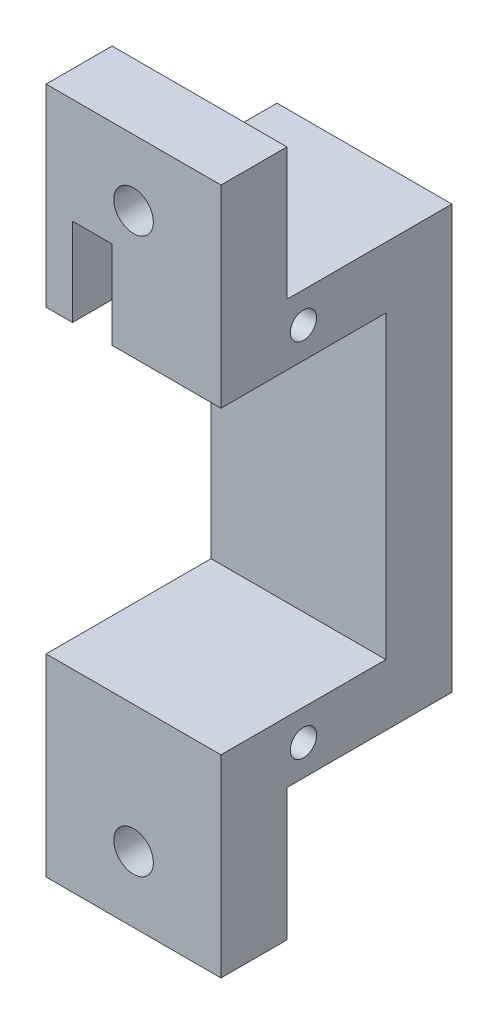
ISO-10303-21;
HEADER;
FILE_DESCRIPTION(('STEP AP214'),'2;1');
FILE_NAME('part.step','',(''),(''),'','','');
FILE_SCHEMA(('AUTOMOTIVE_DESIGN { 1 0 10303 214 1 1 1 1 }'));
ENDSEC;
DATA;
#1=APPLICATION_CONTEXT('core data for automotive mechanical design processes');
#2=APPLICATION_PROTOCOL_DEFINITION('international standard','automotive_design',2000,#1);
#3=PRODUCT_CONTEXT('',#1,'mechanical');
#4=PRODUCT('Part','Part','',(#3));
#5=PRODUCT_RELATED_PRODUCT_CATEGORY('part','',(#4));
#6=PRODUCT_DEFINITION_FORMATION('','',#4);
#7=PRODUCT_DEFINITION_CONTEXT('part definition',#1,'design');
#8=PRODUCT_DEFINITION('design','',#6,#7);
#9=PRODUCT_DEFINITION_SHAPE('','',#8);
#10=(LENGTH_UNIT() NAMED_UNIT(*) SI_UNIT(.MILLI.,.METRE.));
#11=(NAMED_UNIT(*) PLANE_ANGLE_UNIT() SI_UNIT($,.RADIAN.));
#12=(NAMED_UNIT(*) SI_UNIT($,.STERADIAN.) SOLID_ANGLE_UNIT());
#13=UNCERTAINTY_MEASURE_WITH_UNIT(LENGTH_MEASURE(1.E-05),#10,'distance_accuracy_value','');
#14=(GEOMETRIC_REPRESENTATION_CONTEXT(3) GLOBAL_UNCERTAINTY_ASSIGNED_CONTEXT((#13)) GLOBAL_UNIT_ASSIGNED_CONTEXT((#10,
#11,#12)) REPRESENTATION_CONTEXT('',''));
#15=CARTESIAN_POINT('',(0.,0.,0.));
#16=DIRECTION('',(0.,0.,1.));
#17=DIRECTION('',(1.,0.,0.));
#18=AXIS2_PLACEMENT_3D('',#15,#16,#17);
#19=CARTESIAN_POINT('',(-21.7379181981433,-2.325,12.411797698406));
#20=DIRECTION('',(1.,0.,0.));
#21=DIRECTION('',(0.,0.,-1.));
#22=AXIS2_PLACEMENT_3D('',#19,#20,#21);
#23=CYLINDRICAL_SURFACE('',#22,1.);
#24=CARTESIAN_POINT('',(-19.7379181981433,-2.325,12.411797698406));
#25=DIRECTION('',(-1.,0.,0.));
#26=DIRECTION('',(0.,0.,1.));
#27=AXIS2_PLACEMENT_3D('',#24,#25,#26);
#28=CIRCLE('',#27,1.);
#29=CARTESIAN_POINT('',(-19.7379181981433,-2.325,11.411797698406));
#30=VERTEX_POINT('',#29);
#31=EDGE_CURVE('E37',#30,#30,#28,.F.);
#32=CARTESIAN_POINT('',(-21.7379181981433,-2.325,12.411797698406));
#33=DIRECTION('',(1.,0.,0.));
#34=DIRECTION('',(0.,0.,-1.));
#35=AXIS2_PLACEMENT_3D('',#32,#33,#34);
#36=CIRCLE('',#35,1.);
#37=CARTESIAN_POINT('',(-21.7379181981433,-2.325,11.411797698406));
#38=VERTEX_POINT('',#37);
#39=EDGE_CURVE('E218',#38,#38,#36,.T.);
#40=CARTESIAN_POINT('',(-19.7379181981433,-2.325,11.411797698406));
#41=CARTESIAN_POINT('',(-19.7587515314766,-2.325,11.411797698406));
#42=CARTESIAN_POINT('',(-19.77958486481,-2.325,11.411797698406));
#43=CARTESIAN_POINT('',(-19.8212515314766,-2.325,11.411797698406));
#44=CARTESIAN_POINT('',(-19.84208486481,-2.325,11.411797698406));
#45=CARTESIAN_POINT('',(-19.8837515314766,-2.325,11.411797698406));
#46=CARTESIAN_POINT('',(-19.90458486481,-2.325,11.411797698406));
#47=CARTESIAN_POINT('',(-19.9462515314766,-2.325,11.411797698406));
#48=CARTESIAN_POINT('',(-19.96708486481,-2.325,11.411797698406));
#49=CARTESIAN_POINT('',(-20.0087515314766,-2.325,11.411797698406));
#50=CARTESIAN_POINT('',(-20.02958486481,-2.325,11.411797698406));
#51=CARTESIAN_POINT('',(-20.0712515314766,-2.325,11.411797698406));
#52=CARTESIAN_POINT('',(-20.09208486481,-2.325,11.411797698406));
#53=CARTESIAN_POINT('',(-20.1337515314766,-2.325,11.411797698406));
#54=CARTESIAN_POINT('',(-20.15458486481,-2.325,11.411797698406));
#55=CARTESIAN_POINT('',(-20.1962515314766,-2.325,11.411797698406));
#56=CARTESIAN_POINT('',(-20.21708486481,-2.325,11.411797698406));
#57=CARTESIAN_POINT('',(-20.2587515314766,-2.325,11.411797698406));
#58=CARTESIAN_POINT('',(-20.27958486481,-2.325,11.411797698406));
#59=CARTESIAN_POINT('',(-20.3212515314766,-2.325,11.411797698406));
#60=CARTESIAN_POINT('',(-20.34208486481,-2.325,11.411797698406));
#61=CARTESIAN_POINT('',(-20.3837515314766,-2.325,11.411797698406));
#62=CARTESIAN_POINT('',(-20.40458486481,-2.325,11.411797698406));
#63=CARTESIAN_POINT('',(-20.4462515314766,-2.325,11.411797698406));
#64=CARTESIAN_POINT('',(-20.46708486481,-2.325,11.411797698406));
#65=CARTESIAN_POINT('',(-20.5087515314766,-2.325,11.411797698406));
#66=CARTESIAN_POINT('',(-20.52958486481,-2.325,11.411797698406));
#67=CARTESIAN_POINT('',(-20.5712515314766,-2.325,11.411797698406));
#68=CARTESIAN_POINT('',(-20.59208486481,-2.325,11.411797698406));
#69=CARTESIAN_POINT('',(-20.6337515314766,-2.325,11.411797698406));
#70=CARTESIAN_POINT('',(-20.65458486481,-2.325,11.411797698406));
#71=CARTESIAN_POINT('',(-20.6962515314766,-2.325,11.411797698406));
#72=CARTESIAN_POINT('',(-20.71708486481,-2.325,11.411797698406));
#73=CARTESIAN_POINT('',(-20.7587515314766,-2.325,11.411797698406));
#74=CARTESIAN_POINT('',(-20.77958486481,-2.325,11.411797698406));
#75=CARTESIAN_POINT('',(-20.8212515314766,-2.325,11.411797698406));
#76=CARTESIAN_POINT('',(-20.84208486481,-2.325,11.411797698406));
#77=CARTESIAN_POINT('',(-20.8837515314766,-2.325,11.411797698406));
#78=CARTESIAN_POINT('',(-20.90458486481,-2.325,11.411797698406));
#79=CARTESIAN_POINT('',(-20.9462515314766,-2.325,11.411797698406));
#80=CARTESIAN_POINT('',(-20.96708486481,-2.325,11.411797698406));
#81=CARTESIAN_POINT('',(-21.0087515314766,-2.325,11.411797698406));
#82=CARTESIAN_POINT('',(-21.02958486481,-2.325,11.411797698406));
#83=CARTESIAN_POINT('',(-21.0712515314766,-2.325,11.411797698406));
#84=CARTESIAN_POINT('',(-21.09208486481,-2.325,11.411797698406));
#85=CARTESIAN_POINT('',(-21.1337515314766,-2.325,11.411797698406));
#86=CARTESIAN_POINT('',(-21.15458486481,-2.325,11.411797698406));
#87=CARTESIAN_POINT('',(-21.1962515314766,-2.325,11.411797698406));
#88=CARTESIAN_POINT('',(-21.21708486481,-2.325,11.411797698406));
#89=CARTESIAN_POINT('',(-21.2587515314766,-2.325,11.411797698406));
#90=CARTESIAN_POINT('',(-21.27958486481,-2.325,11.411797698406));
#91=CARTESIAN_POINT('',(-21.3212515314766,-2.325,11.411797698406));
#92=CARTESIAN_POINT('',(-21.34208486481,-2.325,11.411797698406));
#93=CARTESIAN_POINT('',(-21.3837515314766,-2.325,11.411797698406));
#94=CARTESIAN_POINT('',(-21.40458486481,-2.325,11.411797698406));
#95=CARTESIAN_POINT('',(-21.4462515314766,-2.325,11.411797698406));
#96=CARTESIAN_POINT('',(-21.46708486481,-2.325,11.411797698406));
#97=CARTESIAN_POINT('',(-21.5087515314766,-2.325,11.411797698406));
#98=CARTESIAN_POINT('',(-21.52958486481,-2.325,11.411797698406));
#99=CARTESIAN_POINT('',(-21.5712515314766,-2.325,11.411797698406));
#100=CARTESIAN_POINT('',(-21.59208486481,-2.325,11.411797698406));
#101=CARTESIAN_POINT('',(-21.6337515314766,-2.325,11.411797698406));
#102=CARTESIAN_POINT('',(-21.65458486481,-2.325,11.411797698406));
#103=CARTESIAN_POINT('',(-21.6962515314766,-2.325,11.411797698406));
#104=CARTESIAN_POINT('',(-21.71708486481,-2.325,11.411797698406));
#105=CARTESIAN_POINT('',(-21.7379181981433,-2.325,11.411797698406));
#106=B_SPLINE_CURVE_WITH_KNOTS('',3,(#40,#41,#42,#43,#44,#45,#46,#47,#48,#49,#50,#51,#52,#53,
#54,#55,#56,#57,#58,#59,#60,#61,#62,#63,#64,#65,#66,#67,#68,#69,#70,#71,#72,#73,#74,#75,#76,#77,
#78,#79,#80,#81,#82,#83,#84,#85,#86,#87,#88,#89,#90,#91,#92,#93,#94,#95,#96,#97,#98,#99,#100,
#101,#102,#103,#104,#105),.UNSPECIFIED.,.F.,.F.,(4,2,2,2,2,2,2,2,2,2,2,2,2,2,2,2,2,2,2,2,2,2,2,
2,2,2,2,2,2,2,2,2,4),(0.,0.0625000000000001,0.125000000000004,0.187500000000004,
0.250000000000004,0.312500000000004,0.375000000000004,0.437500000000004,0.500000000000004,
0.562500000000004,0.625000000000004,0.687500000000004,0.750000000000008,0.812500000000008,
0.875000000000008,0.937500000000008,1.00000000000001,1.06250000000001,1.12500000000001,
1.18750000000001,1.25000000000001,1.31250000000001,1.37500000000001,1.43750000000001,
1.50000000000001,1.56250000000001,1.62500000000001,1.68750000000001,1.75000000000001,
1.81250000000001,1.87500000000001,1.93750000000001,2.00000000000001),.UNSPECIFIED.);
#107=EDGE_CURVE('BSEAM33',#30,#38,#106,.T.);
#108=ORIENTED_EDGE('',*,*,#31,.T.);
#109=ORIENTED_EDGE('',*,*,#39,.F.);
#110=ORIENTED_EDGE('',*,*,#107,.T.);
#111=ORIENTED_EDGE('',*,*,#107,.F.);
#112=EDGE_LOOP('',(#108,#110,#109,#111));
#113=FACE_BOUND('',#112,.T.);
#114=ADVANCED_FACE('F33',(#113),#23,.F.);
#115=CARTESIAN_POINT('',(-21.7379181981433,-32.05,1.16179769840603));
#116=DIRECTION('',(0.,1.,0.));
#117=DIRECTION('',(-1.,0.,0.));
#118=AXIS2_PLACEMENT_3D('',#115,#116,#117);
#119=PLANE('',#118);
#120=DIRECTION('',(1.,0.,0.));
#121=VECTOR('',#120,1.);
#122=CARTESIAN_POINT('',(-21.7379181981433,-32.05,13.661797698406));
#123=LINE('',#122,#121);
#124=CARTESIAN_POINT('',(-21.7379181981433,-32.05,13.661797698406));
#125=VERTEX_POINT('',#124);
#126=CARTESIAN_POINT('',(-8.48791819814331,-32.05,13.661797698406));
#127=VERTEX_POINT('',#126);
#128=EDGE_CURVE('E253',#125,#127,#123,.T.);
#129=ORIENTED_EDGE('',*,*,#128,.F.);
#130=DIRECTION('',(0.,0.,1.));
#131=VECTOR('',#130,1.);
#132=CARTESIAN_POINT('',(-21.7379181981433,-32.05,1.16179769840603));
#133=LINE('',#132,#131);
#134=CARTESIAN_POINT('',(-21.7379181981433,-32.05,1.16179769840603));
#135=VERTEX_POINT('',#134);
#136=EDGE_CURVE('E299',#135,#125,#133,.T.);
#137=ORIENTED_EDGE('',*,*,#136,.F.);
#138=DIRECTION('',(-1.,0.,0.));
#139=VECTOR('',#138,1.);
#140=CARTESIAN_POINT('',(-21.7379181981433,-32.05,1.16179769840603));
#141=LINE('',#140,#139);
#142=CARTESIAN_POINT('',(-8.48791819814331,-32.05,1.16179769840603));
#143=VERTEX_POINT('',#142);
#144=EDGE_CURVE('E297',#143,#135,#141,.T.);
#145=ORIENTED_EDGE('',*,*,#144,.F.);
#146=DIRECTION('',(0.,0.,1.));
#147=VECTOR('',#146,1.);
#148=CARTESIAN_POINT('',(-8.48791819814331,-32.05,1.16179769840603));
#149=LINE('',#148,#147);
#150=EDGE_CURVE('E305',#143,#127,#149,.T.);
#151=ORIENTED_EDGE('',*,*,#150,.T.);
#152=EDGE_LOOP('',(#129,#137,#145,#151));
#153=FACE_BOUND('',#152,.T.);
#154=ADVANCED_FACE('F391',(#153),#119,.F.);
#155=CARTESIAN_POINT('',(0.,0.,6.16179769840603));
#156=DIRECTION('',(0.,0.,1.));
#157=DIRECTION('',(1.,0.,0.));
#158=AXIS2_PLACEMENT_3D('',#155,#156,#157);
#159=PLANE('',#158);
#160=DIRECTION('',(0.,1.,0.));
#161=VECTOR('',#160,1.);
#162=CARTESIAN_POINT('',(-21.7379181981433,0.,6.16179769840603));
#163=LINE('',#162,#161);
#164=CARTESIAN_POINT('',(-21.7379181981433,-27.4,6.16179769840603));
#165=VERTEX_POINT('',#164);
#166=CARTESIAN_POINT('',(-21.7379181981433,-4.65,6.16179769840603));
#167=VERTEX_POINT('',#166);
#168=EDGE_CURVE('E287',#165,#167,#163,.T.);
#169=ORIENTED_EDGE('',*,*,#168,.F.);
#170=DIRECTION('',(-1.,0.,0.));
#171=VECTOR('',#170,1.);
#172=CARTESIAN_POINT('',(-8.48791819814331,-27.4,6.16179769840603));
#173=LINE('',#172,#171);
#174=CARTESIAN_POINT('',(-8.48791819814331,-27.4,6.16179769840603));
#175=VERTEX_POINT('',#174);
#176=EDGE_CURVE('E273',#175,#165,#173,.T.);
#177=ORIENTED_EDGE('',*,*,#176,.F.);
#178=DIRECTION('',(0.,-1.,0.));
#179=VECTOR('',#178,1.);
#180=CARTESIAN_POINT('',(-8.4879181981433,0.,6.16179769840603));
#181=LINE('',#180,#179);
#182=CARTESIAN_POINT('',(-8.4879181981433,-4.65,6.16179769840603));
#183=VERTEX_POINT('',#182);
#184=EDGE_CURVE('E292',#183,#175,#181,.T.);
#185=ORIENTED_EDGE('',*,*,#184,.F.);
#186=DIRECTION('',(-1.,0.,0.));
#187=VECTOR('',#186,1.);
#188=CARTESIAN_POINT('',(-21.7379181981433,-4.65,6.16179769840603));
#189=LINE('',#188,#187);
#190=EDGE_CURVE('E318',#183,#167,#189,.T.);
#191=ORIENTED_EDGE('',*,*,#190,.T.);
#192=EDGE_LOOP('',(#169,#177,#185,#191));
#193=FACE_BOUND('',#192,.T.);
#194=ADVANCED_FACE('F388',(#193),#159,.T.);
#195=CARTESIAN_POINT('',(-21.7379181981433,-4.65,6.16179769840603));
#196=DIRECTION('',(-1.,0.,0.));
#197=DIRECTION('',(0.,0.,1.));
#198=AXIS2_PLACEMENT_3D('',#195,#196,#197);
#199=PLANE('',#198);
#200=CARTESIAN_POINT('',(-21.7379181981433,-29.725,12.411797698406));
#201=DIRECTION('',(1.,0.,0.));
#202=DIRECTION('',(0.,0.,-1.));
#203=AXIS2_PLACEMENT_3D('',#200,#201,#202);
#204=CIRCLE('',#203,1.);
#205=CARTESIAN_POINT('',(-21.7379181981433,-29.725,11.411797698406));
#206=VERTEX_POINT('',#205);
#207=EDGE_CURVE('E212',#206,#206,#204,.T.);
#208=ORIENTED_EDGE('',*,*,#207,.T.);
#209=EDGE_LOOP('',(#208));
#210=FACE_BOUND('',#209,.T.);
#211=ORIENTED_EDGE('',*,*,#39,.T.);
#212=EDGE_LOOP('',(#211));
#213=FACE_BOUND('',#212,.T.);
#214=DIRECTION('',(0.,0.,1.));
#215=VECTOR('',#214,1.);
#216=CARTESIAN_POINT('',(-21.7379181981433,0.,6.16179769840603));
#217=LINE('',#216,#215);
#218=CARTESIAN_POINT('',(-21.7379181981433,0.,1.16179769840603));
#219=VERTEX_POINT('',#218);
#220=CARTESIAN_POINT('',(-21.7379181981433,0.,13.661797698406));
#221=VERTEX_POINT('',#220);
#222=EDGE_CURVE('E307',#219,#221,#217,.T.);
#223=ORIENTED_EDGE('',*,*,#222,.F.);
#224=DIRECTION('',(0.,1.,0.));
#225=VECTOR('',#224,1.);
#226=CARTESIAN_POINT('',(-21.7379181981433,0.,1.16179769840603));
#227=LINE('',#226,#225);
#228=EDGE_CURVE('E288',#135,#219,#227,.T.);
#229=ORIENTED_EDGE('',*,*,#228,.F.);
#230=ORIENTED_EDGE('',*,*,#136,.T.);
#231=DIRECTION('',(0.,1.,0.));
#232=VECTOR('',#231,1.);
#233=CARTESIAN_POINT('',(-21.7379181981433,-42.05,13.661797698406));
#234=LINE('',#233,#232);
#235=CARTESIAN_POINT('',(-21.7379181981433,-42.05,13.661797698406));
#236=VERTEX_POINT('',#235);
#237=EDGE_CURVE('E270',#236,#125,#234,.T.);
#238=ORIENTED_EDGE('',*,*,#237,.F.);
#239=DIRECTION('',(0.,0.,-1.));
#240=VECTOR('',#239,1.);
#241=CARTESIAN_POINT('',(-21.7379181981433,-42.05,18.661797698406));
#242=LINE('',#241,#240);
#243=CARTESIAN_POINT('',(-21.7379181981433,-42.05,18.661797698406));
#244=VERTEX_POINT('',#243);
#245=EDGE_CURVE('E254',#244,#236,#242,.T.);
#246=ORIENTED_EDGE('',*,*,#245,.F.);
#247=DIRECTION('',(0.,-1.,0.));
#248=VECTOR('',#247,1.);
#249=CARTESIAN_POINT('',(-21.7379181981433,-32.05,18.661797698406));
#250=LINE('',#249,#248);
#251=CARTESIAN_POINT('',(-21.7379181981433,-27.4,18.661797698406));
#252=VERTEX_POINT('',#251);
#253=EDGE_CURVE('E279',#252,#244,#250,.T.);
#254=ORIENTED_EDGE('',*,*,#253,.F.);
#255=DIRECTION('',(0.,0.,-1.));
#256=VECTOR('',#255,1.);
#257=CARTESIAN_POINT('',(-21.7379181981433,-27.4,18.661797698406));
#258=LINE('',#257,#256);
#259=EDGE_CURVE('E281',#252,#165,#258,.T.);
#260=ORIENTED_EDGE('',*,*,#259,.T.);
#261=ORIENTED_EDGE('',*,*,#168,.T.);
#262=DIRECTION('',(0.,0.,1.));
#263=VECTOR('',#262,1.);
#264=CARTESIAN_POINT('',(-21.7379181981433,-4.65,6.16179769840603));
#265=LINE('',#264,#263);
#266=CARTESIAN_POINT('',(-21.7379181981433,-4.65,18.661797698406));
#267=VERTEX_POINT('',#266);
#268=EDGE_CURVE('E308',#167,#267,#265,.T.);
#269=ORIENTED_EDGE('',*,*,#268,.T.);
#270=DIRECTION('',(0.,1.,0.));
#271=VECTOR('',#270,1.);
#272=CARTESIAN_POINT('',(-21.7379181981433,-4.65,18.661797698406));
#273=LINE('',#272,#271);
#274=CARTESIAN_POINT('',(-21.7379181981433,10.,18.661797698406));
#275=VERTEX_POINT('',#274);
#276=EDGE_CURVE('E42',#267,#275,#273,.T.);
#277=ORIENTED_EDGE('',*,*,#276,.T.);
#278=DIRECTION('',(0.,0.,1.));
#279=VECTOR('',#278,1.);
#280=CARTESIAN_POINT('',(-21.7379181981433,10.,18.661797698406));
#281=LINE('',#280,#279);
#282=CARTESIAN_POINT('',(-21.7379181981433,10.,13.661797698406));
#283=VERTEX_POINT('',#282);
#284=EDGE_CURVE('E236',#283,#275,#281,.T.);
#285=ORIENTED_EDGE('',*,*,#284,.F.);
#286=DIRECTION('',(0.,-1.,0.));
#287=VECTOR('',#286,1.);
#288=CARTESIAN_POINT('',(-21.7379181981433,10.,13.661797698406));
#289=LINE('',#288,#287);
#290=EDGE_CURVE('E246',#283,#221,#289,.T.);
#291=ORIENTED_EDGE('',*,*,#290,.T.);
#292=EDGE_LOOP('',(#223,#229,#230,#238,#246,#254,#260,#261,#269,#277,#285,#291));
#293=FACE_BOUND('',#292,.T.);
#294=ADVANCED_FACE('F35',(#210,#213,#293),#199,.T.);
#295=CARTESIAN_POINT('',(-8.4879181981433,-4.65,6.16179769840603));
#296=DIRECTION('',(1.,0.,0.));
#297=DIRECTION('',(0.,0.,-1.));
#298=AXIS2_PLACEMENT_3D('',#295,#296,#297);
#299=PLANE('',#298);
#300=CARTESIAN_POINT('',(-8.4879181981433,-29.725,12.411797698406));
#301=DIRECTION('',(1.,0.,0.));
#302=DIRECTION('',(0.,0.,-1.));
#303=AXIS2_PLACEMENT_3D('',#300,#301,#302);
#304=CIRCLE('',#303,1.);
#305=CARTESIAN_POINT('',(-8.4879181981433,-29.725,11.411797698406));
#306=VERTEX_POINT('',#305);
#307=EDGE_CURVE('E211',#306,#306,#304,.T.);
#308=ORIENTED_EDGE('',*,*,#307,.F.);
#309=EDGE_LOOP('',(#308));
#310=FACE_BOUND('',#309,.T.);
#311=CARTESIAN_POINT('',(-8.4879181981433,-2.325,12.411797698406));
#312=DIRECTION('',(1.,0.,0.));
#313=DIRECTION('',(0.,0.,-1.));
#314=AXIS2_PLACEMENT_3D('',#311,#312,#313);
#315=CIRCLE('',#314,1.);
#316=CARTESIAN_POINT('',(-8.4879181981433,-2.325,11.411797698406));
#317=VERTEX_POINT('',#316);
#318=EDGE_CURVE('E215',#317,#317,#315,.T.);
#319=ORIENTED_EDGE('',*,*,#318,.F.);
#320=EDGE_LOOP('',(#319));
#321=FACE_BOUND('',#320,.T.);
#322=DIRECTION('',(0.,0.,-1.));
#323=VECTOR('',#322,1.);
#324=CARTESIAN_POINT('',(-8.4879181981433,0.,6.16179769840603));
#325=LINE('',#324,#323);
#326=CARTESIAN_POINT('',(-8.4879181981433,0.,13.661797698406));
#327=VERTEX_POINT('',#326);
#328=CARTESIAN_POINT('',(-8.4879181981433,0.,1.16179769840603));
#329=VERTEX_POINT('',#328);
#330=EDGE_CURVE('E312',#327,#329,#325,.T.);
#331=ORIENTED_EDGE('',*,*,#330,.F.);
#332=DIRECTION('',(0.,-1.,0.));
#333=VECTOR('',#332,1.);
#334=CARTESIAN_POINT('',(-8.4879181981433,10.,13.661797698406));
#335=LINE('',#334,#333);
#336=CARTESIAN_POINT('',(-8.4879181981433,10.,13.661797698406));
#337=VERTEX_POINT('',#336);
#338=EDGE_CURVE('E250',#337,#327,#335,.T.);
#339=ORIENTED_EDGE('',*,*,#338,.F.);
#340=DIRECTION('',(0.,0.,-1.));
#341=VECTOR('',#340,1.);
#342=CARTESIAN_POINT('',(-8.4879181981433,10.,18.661797698406));
#343=LINE('',#342,#341);
#344=CARTESIAN_POINT('',(-8.4879181981433,10.,18.661797698406));
#345=VERTEX_POINT('',#344);
#346=EDGE_CURVE('E242',#345,#337,#343,.T.);
#347=ORIENTED_EDGE('',*,*,#346,.F.);
#348=DIRECTION('',(0.,1.,0.));
#349=VECTOR('',#348,1.);
#350=CARTESIAN_POINT('',(-8.4879181981433,-4.65,18.661797698406));
#351=LINE('',#350,#349);
#352=CARTESIAN_POINT('',(-8.4879181981433,-4.65,18.661797698406));
#353=VERTEX_POINT('',#352);
#354=EDGE_CURVE('E11',#353,#345,#351,.T.);
#355=ORIENTED_EDGE('',*,*,#354,.F.);
#356=DIRECTION('',(0.,0.,-1.));
#357=VECTOR('',#356,1.);
#358=CARTESIAN_POINT('',(-8.4879181981433,-4.65,6.16179769840603));
#359=LINE('',#358,#357);
#360=EDGE_CURVE('E316',#353,#183,#359,.T.);
#361=ORIENTED_EDGE('',*,*,#360,.T.);
#362=ORIENTED_EDGE('',*,*,#184,.T.);
#363=DIRECTION('',(0.,0.,-1.));
#364=VECTOR('',#363,1.);
#365=CARTESIAN_POINT('',(-8.48791819814331,-27.4,18.661797698406));
#366=LINE('',#365,#364);
#367=CARTESIAN_POINT('',(-8.48791819814331,-27.4,18.661797698406));
#368=VERTEX_POINT('',#367);
#369=EDGE_CURVE('E285',#368,#175,#366,.T.);
#370=ORIENTED_EDGE('',*,*,#369,.F.);
#371=DIRECTION('',(0.,1.,0.));
#372=VECTOR('',#371,1.);
#373=CARTESIAN_POINT('',(-8.48791819814331,-32.05,18.661797698406));
#374=LINE('',#373,#372);
#375=CARTESIAN_POINT('',(-8.48791819814331,-42.05,18.661797698406));
#376=VERTEX_POINT('',#375);
#377=EDGE_CURVE('E274',#376,#368,#374,.T.);
#378=ORIENTED_EDGE('',*,*,#377,.F.);
#379=DIRECTION('',(0.,0.,1.));
#380=VECTOR('',#379,1.);
#381=CARTESIAN_POINT('',(-8.48791819814331,-42.05,18.661797698406));
#382=LINE('',#381,#380);
#383=CARTESIAN_POINT('',(-8.48791819814331,-42.05,13.661797698406));
#384=VERTEX_POINT('',#383);
#385=EDGE_CURVE('E259',#384,#376,#382,.T.);
#386=ORIENTED_EDGE('',*,*,#385,.F.);
#387=DIRECTION('',(0.,1.,0.));
#388=VECTOR('',#387,1.);
#389=CARTESIAN_POINT('',(-8.48791819814331,-42.05,13.661797698406));
#390=LINE('',#389,#388);
#391=EDGE_CURVE('E265',#384,#127,#390,.T.);
#392=ORIENTED_EDGE('',*,*,#391,.T.);
#393=ORIENTED_EDGE('',*,*,#150,.F.);
#394=DIRECTION('',(0.,-1.,0.));
#395=VECTOR('',#394,1.);
#396=CARTESIAN_POINT('',(-8.4879181981433,0.,1.16179769840603));
#397=LINE('',#396,#395);
#398=EDGE_CURVE('E295',#329,#143,#397,.T.);
#399=ORIENTED_EDGE('',*,*,#398,.F.);
#400=EDGE_LOOP('',(#331,#339,#347,#355,#361,#362,#370,#378,#386,#392,#393,#399));
#401=FACE_BOUND('',#400,.T.);
#402=ADVANCED_FACE('F359',(#310,#321,#401),#299,.T.);
#403=CARTESIAN_POINT('',(-21.7379181981433,-4.65,18.661797698406));
#404=DIRECTION('',(0.,0.,1.));
#405=DIRECTION('',(1.,0.,0.));
#406=AXIS2_PLACEMENT_3D('',#403,#404,#405);
#407=PLANE('',#406);
#408=DIRECTION('',(0.,1.,0.));
#409=VECTOR('',#408,1.);
#410=CARTESIAN_POINT('',(-19.7379181981433,-10.,18.661797698406));
#411=LINE('',#410,#409);
#412=CARTESIAN_POINT('',(-19.7379181981433,-4.65,18.661797698406));
#413=VERTEX_POINT('',#412);
#414=CARTESIAN_POINT('',(-19.7379181981433,2.,18.661797698406));
#415=VERTEX_POINT('',#414);
#416=EDGE_CURVE('E194',#413,#415,#411,.T.);
#417=ORIENTED_EDGE('',*,*,#416,.T.);
#418=DIRECTION('',(-1.,0.,0.));
#419=VECTOR('',#418,1.);
#420=CARTESIAN_POINT('',(-21.7379181981433,2.,18.661797698406));
#421=LINE('',#420,#419);
#422=CARTESIAN_POINT('',(-16.7379181981433,2.,18.661797698406));
#423=VERTEX_POINT('',#422);
#424=EDGE_CURVE('E169',#423,#415,#421,.T.);
#425=ORIENTED_EDGE('',*,*,#424,.F.);
#426=DIRECTION('',(0.,1.,0.));
#427=VECTOR('',#426,1.);
#428=CARTESIAN_POINT('',(-16.7379181981433,-10.,18.661797698406));
#429=LINE('',#428,#427);
#430=CARTESIAN_POINT('',(-16.7379181981433,-4.65,18.661797698406));
#431=VERTEX_POINT('',#430);
#432=EDGE_CURVE('E199',#431,#423,#429,.T.);
#433=ORIENTED_EDGE('',*,*,#432,.F.);
#434=DIRECTION('',(1.,0.,0.));
#435=VECTOR('',#434,1.);
#436=CARTESIAN_POINT('',(-21.7379181981433,-4.65,18.661797698406));
#437=LINE('',#436,#435);
#438=EDGE_CURVE('E311',#431,#353,#437,.T.);
#439=ORIENTED_EDGE('',*,*,#438,.T.);
#440=ORIENTED_EDGE('',*,*,#354,.T.);
#441=DIRECTION('',(1.,0.,0.));
#442=VECTOR('',#441,1.);
#443=CARTESIAN_POINT('',(-21.7379181981433,10.,18.661797698406));
#444=LINE('',#443,#442);
#445=EDGE_CURVE('E239',#275,#345,#444,.T.);
#446=ORIENTED_EDGE('',*,*,#445,.F.);
#447=ORIENTED_EDGE('',*,*,#276,.F.);
#448=EDGE_CURVE('E313',#267,#413,#437,.T.);
#449=ORIENTED_EDGE('',*,*,#448,.T.);
#450=EDGE_LOOP('',(#417,#425,#433,#439,#440,#446,#447,#449));
#451=FACE_BOUND('',#450,.T.);
#452=CARTESIAN_POINT('',(-15.1129181981433,5.,18.661797698406));
#453=DIRECTION('',(0.,0.,1.));
#454=DIRECTION('',(1.,0.,0.));
#455=AXIS2_PLACEMENT_3D('',#452,#453,#454);
#456=CIRCLE('',#455,1.5);
#457=CARTESIAN_POINT('',(-13.6129181981433,5.,18.661797698406));
#458=VERTEX_POINT('',#457);
#459=EDGE_CURVE('E232',#458,#458,#456,.T.);
#460=ORIENTED_EDGE('',*,*,#459,.F.);
#461=EDGE_LOOP('',(#460));
#462=FACE_BOUND('',#461,.T.);
#463=ADVANCED_FACE('F336',(#451,#462),#407,.T.);
#464=CARTESIAN_POINT('',(0.,-4.65,0.));
#465=DIRECTION('',(0.,1.,0.));
#466=DIRECTION('',(0.,0.,1.));
#467=AXIS2_PLACEMENT_3D('',#464,#465,#466);
#468=PLANE('',#467);
#469=DIRECTION('',(-1.,0.,0.));
#470=VECTOR('',#469,1.);
#471=CARTESIAN_POINT('',(0.,-4.65,8.27082062568252));
#472=LINE('',#471,#470);
#473=CARTESIAN_POINT('',(-16.7379181981433,-4.65,8.27082062568252));
#474=VERTEX_POINT('',#473);
#475=CARTESIAN_POINT('',(-19.7379181981433,-4.65,8.27082062568252));
#476=VERTEX_POINT('',#475);
#477=EDGE_CURVE('E208',#474,#476,#472,.T.);
#478=ORIENTED_EDGE('',*,*,#477,.T.);
#479=DIRECTION('',(0.,0.,1.));
#480=VECTOR('',#479,1.);
#481=CARTESIAN_POINT('',(-19.7379181981433,-4.65,0.));
#482=LINE('',#481,#480);
#483=EDGE_CURVE('E205',#476,#413,#482,.T.);
#484=ORIENTED_EDGE('',*,*,#483,.T.);
#485=ORIENTED_EDGE('',*,*,#448,.F.);
#486=ORIENTED_EDGE('',*,*,#268,.F.);
#487=ORIENTED_EDGE('',*,*,#190,.F.);
#488=ORIENTED_EDGE('',*,*,#360,.F.);
#489=ORIENTED_EDGE('',*,*,#438,.F.);
#490=DIRECTION('',(0.,0.,-1.));
#491=VECTOR('',#490,1.);
#492=CARTESIAN_POINT('',(-16.7379181981433,-4.65,0.));
#493=LINE('',#492,#491);
#494=EDGE_CURVE('E202',#431,#474,#493,.T.);
#495=ORIENTED_EDGE('',*,*,#494,.T.);
#496=EDGE_LOOP('',(#478,#484,#485,#486,#487,#488,#489,#495));
#497=FACE_BOUND('',#496,.T.);
#498=ADVANCED_FACE('F341',(#497),#468,.F.);
#499=CARTESIAN_POINT('',(0.,0.,0.));
#500=DIRECTION('',(0.,1.,0.));
#501=DIRECTION('',(0.,0.,1.));
#502=AXIS2_PLACEMENT_3D('',#499,#500,#501);
#503=PLANE('',#502);
#504=DIRECTION('',(0.,0.,1.));
#505=VECTOR('',#504,1.);
#506=CARTESIAN_POINT('',(-19.7379181981433,0.,18.661797698406));
#507=LINE('',#506,#505);
#508=CARTESIAN_POINT('',(-19.7379181981433,0.,8.27082062568252));
#509=VERTEX_POINT('',#508);
#510=CARTESIAN_POINT('',(-19.7379181981433,0.,13.661797698406));
#511=VERTEX_POINT('',#510);
#512=EDGE_CURVE('E178',#509,#511,#507,.T.);
#513=ORIENTED_EDGE('',*,*,#512,.F.);
#514=DIRECTION('',(-1.,0.,0.));
#515=VECTOR('',#514,1.);
#516=CARTESIAN_POINT('',(-19.7379181981433,0.,8.27082062568252));
#517=LINE('',#516,#515);
#518=CARTESIAN_POINT('',(-16.7379181981433,0.,8.27082062568252));
#519=VERTEX_POINT('',#518);
#520=EDGE_CURVE('E191',#519,#509,#517,.T.);
#521=ORIENTED_EDGE('',*,*,#520,.F.);
#522=DIRECTION('',(0.,0.,-1.));
#523=VECTOR('',#522,1.);
#524=CARTESIAN_POINT('',(-16.7379181981433,0.,18.661797698406));
#525=LINE('',#524,#523);
#526=CARTESIAN_POINT('',(-16.7379181981433,0.,13.661797698406));
#527=VERTEX_POINT('',#526);
#528=EDGE_CURVE('E189',#527,#519,#525,.T.);
#529=ORIENTED_EDGE('',*,*,#528,.F.);
#530=DIRECTION('',(-1.,0.,0.));
#531=VECTOR('',#530,1.);
#532=CARTESIAN_POINT('',(-21.7379181981433,0.,13.661797698406));
#533=LINE('',#532,#531);
#534=EDGE_CURVE('E58',#327,#527,#533,.T.);
#535=ORIENTED_EDGE('',*,*,#534,.F.);
#536=ORIENTED_EDGE('',*,*,#330,.T.);
#537=DIRECTION('',(1.,0.,0.));
#538=VECTOR('',#537,1.);
#539=CARTESIAN_POINT('',(-21.7379181981433,0.,1.16179769840603));
#540=LINE('',#539,#538);
#541=EDGE_CURVE('E291',#219,#329,#540,.T.);
#542=ORIENTED_EDGE('',*,*,#541,.F.);
#543=ORIENTED_EDGE('',*,*,#222,.T.);
#544=EDGE_CURVE('E235',#511,#221,#533,.T.);
#545=ORIENTED_EDGE('',*,*,#544,.F.);
#546=EDGE_LOOP('',(#513,#521,#529,#535,#536,#542,#543,#545));
#547=FACE_BOUND('',#546,.T.);
#548=ADVANCED_FACE('F346',(#547),#503,.T.);
#549=CARTESIAN_POINT('',(0.,0.,1.16179769840603));
#550=DIRECTION('',(0.,0.,1.));
#551=DIRECTION('',(1.,0.,0.));
#552=AXIS2_PLACEMENT_3D('',#549,#550,#551);
#553=PLANE('',#552);
#554=ORIENTED_EDGE('',*,*,#228,.T.);
#555=ORIENTED_EDGE('',*,*,#541,.T.);
#556=ORIENTED_EDGE('',*,*,#398,.T.);
#557=ORIENTED_EDGE('',*,*,#144,.T.);
#558=EDGE_LOOP('',(#554,#555,#556,#557));
#559=FACE_BOUND('',#558,.T.);
#560=ADVANCED_FACE('F363',(#559),#553,.F.);
#561=CARTESIAN_POINT('',(-8.48791819814331,-27.4,18.661797698406));
#562=DIRECTION('',(0.,-1.,0.));
#563=DIRECTION('',(1.,0.,0.));
#564=AXIS2_PLACEMENT_3D('',#561,#562,#563);
#565=PLANE('',#564);
#566=ORIENTED_EDGE('',*,*,#176,.T.);
#567=ORIENTED_EDGE('',*,*,#259,.F.);
#568=DIRECTION('',(-1.,0.,0.));
#569=VECTOR('',#568,1.);
#570=CARTESIAN_POINT('',(-8.48791819814331,-27.4,18.661797698406));
#571=LINE('',#570,#569);
#572=EDGE_CURVE('E277',#368,#252,#571,.T.);
#573=ORIENTED_EDGE('',*,*,#572,.F.);
#574=ORIENTED_EDGE('',*,*,#369,.T.);
#575=EDGE_LOOP('',(#566,#567,#573,#574));
#576=FACE_BOUND('',#575,.T.);
#577=ADVANCED_FACE('F384',(#576),#565,.F.);
#578=CARTESIAN_POINT('',(0.,0.,18.661797698406));
#579=DIRECTION('',(0.,0.,1.));
#580=DIRECTION('',(1.,0.,0.));
#581=AXIS2_PLACEMENT_3D('',#578,#579,#580);
#582=PLANE('',#581);
#583=CARTESIAN_POINT('',(-15.1129181981433,-37.05,18.661797698406));
#584=DIRECTION('',(0.,0.,1.));
#585=DIRECTION('',(1.,0.,0.));
#586=AXIS2_PLACEMENT_3D('',#583,#584,#585);
#587=CIRCLE('',#586,1.5);
#588=CARTESIAN_POINT('',(-13.6129181981433,-37.05,18.661797698406));
#589=VERTEX_POINT('',#588);
#590=EDGE_CURVE('E226',#589,#589,#587,.T.);
#591=ORIENTED_EDGE('',*,*,#590,.F.);
#592=EDGE_LOOP('',(#591));
#593=FACE_BOUND('',#592,.T.);
#594=ORIENTED_EDGE('',*,*,#377,.T.);
#595=ORIENTED_EDGE('',*,*,#572,.T.);
#596=ORIENTED_EDGE('',*,*,#253,.T.);
#597=DIRECTION('',(-1.,0.,0.));
#598=VECTOR('',#597,1.);
#599=CARTESIAN_POINT('',(-21.7379181981433,-42.05,18.661797698406));
#600=LINE('',#599,#598);
#601=EDGE_CURVE('E262',#376,#244,#600,.T.);
#602=ORIENTED_EDGE('',*,*,#601,.F.);
#603=EDGE_LOOP('',(#594,#595,#596,#602));
#604=FACE_BOUND('',#603,.T.);
#605=ADVANCED_FACE('F381',(#593,#604),#582,.T.);
#606=CARTESIAN_POINT('',(-21.7379181981433,-42.05,13.661797698406));
#607=DIRECTION('',(0.,0.,1.));
#608=DIRECTION('',(1.,0.,0.));
#609=AXIS2_PLACEMENT_3D('',#606,#607,#608);
#610=PLANE('',#609);
#611=CARTESIAN_POINT('',(-15.1129181981433,-37.05,13.661797698406));
#612=DIRECTION('',(0.,0.,-1.));
#613=DIRECTION('',(-1.,0.,0.));
#614=AXIS2_PLACEMENT_3D('',#611,#612,#613);
#615=CIRCLE('',#614,1.5);
#616=CARTESIAN_POINT('',(-16.6129181981433,-37.05,13.661797698406));
#617=VERTEX_POINT('',#616);
#618=EDGE_CURVE('E221',#617,#617,#615,.T.);
#619=ORIENTED_EDGE('',*,*,#618,.F.);
#620=EDGE_LOOP('',(#619));
#621=FACE_BOUND('',#620,.T.);
#622=ORIENTED_EDGE('',*,*,#128,.T.);
#623=ORIENTED_EDGE('',*,*,#391,.F.);
#624=DIRECTION('',(1.,0.,0.));
#625=VECTOR('',#624,1.);
#626=CARTESIAN_POINT('',(-21.7379181981433,-42.05,13.661797698406));
#627=LINE('',#626,#625);
#628=EDGE_CURVE('E257',#236,#384,#627,.T.);
#629=ORIENTED_EDGE('',*,*,#628,.F.);
#630=ORIENTED_EDGE('',*,*,#237,.T.);
#631=EDGE_LOOP('',(#622,#623,#629,#630));
#632=FACE_BOUND('',#631,.T.);
#633=ADVANCED_FACE('F371',(#621,#632),#610,.F.);
#634=CARTESIAN_POINT('',(0.,-42.05,0.));
#635=DIRECTION('',(0.,-1.,0.));
#636=DIRECTION('',(1.,0.,0.));
#637=AXIS2_PLACEMENT_3D('',#634,#635,#636);
#638=PLANE('',#637);
#639=ORIENTED_EDGE('',*,*,#245,.T.);
#640=ORIENTED_EDGE('',*,*,#628,.T.);
#641=ORIENTED_EDGE('',*,*,#385,.T.);
#642=ORIENTED_EDGE('',*,*,#601,.T.);
#643=EDGE_LOOP('',(#639,#640,#641,#642));
#644=FACE_BOUND('',#643,.T.);
#645=ADVANCED_FACE('F375',(#644),#638,.T.);
#646=CARTESIAN_POINT('',(-21.7379181981433,10.,13.661797698406));
#647=DIRECTION('',(0.,0.,1.));
#648=DIRECTION('',(1.,0.,0.));
#649=AXIS2_PLACEMENT_3D('',#646,#647,#648);
#650=PLANE('',#649);
#651=CARTESIAN_POINT('',(-15.1129181981433,5.,13.661797698406));
#652=DIRECTION('',(0.,0.,-1.));
#653=DIRECTION('',(-1.,0.,0.));
#654=AXIS2_PLACEMENT_3D('',#651,#652,#653);
#655=CIRCLE('',#654,1.5);
#656=CARTESIAN_POINT('',(-16.6129181981433,5.,13.661797698406));
#657=VERTEX_POINT('',#656);
#658=EDGE_CURVE('E229',#657,#657,#655,.T.);
#659=ORIENTED_EDGE('',*,*,#658,.F.);
#660=EDGE_LOOP('',(#659));
#661=FACE_BOUND('',#660,.T.);
#662=DIRECTION('',(1.,0.,0.));
#663=VECTOR('',#662,1.);
#664=CARTESIAN_POINT('',(-19.7379181981433,2.,13.661797698406));
#665=LINE('',#664,#663);
#666=CARTESIAN_POINT('',(-19.7379181981433,2.,13.661797698406));
#667=VERTEX_POINT('',#666);
#668=CARTESIAN_POINT('',(-16.7379181981433,2.,13.661797698406));
#669=VERTEX_POINT('',#668);
#670=EDGE_CURVE('E166',#667,#669,#665,.T.);
#671=ORIENTED_EDGE('',*,*,#670,.F.);
#672=DIRECTION('',(0.,1.,0.));
#673=VECTOR('',#672,1.);
#674=CARTESIAN_POINT('',(-19.7379181981433,0.,13.661797698406));
#675=LINE('',#674,#673);
#676=EDGE_CURVE('E175',#511,#667,#675,.T.);
#677=ORIENTED_EDGE('',*,*,#676,.F.);
#678=ORIENTED_EDGE('',*,*,#544,.T.);
#679=ORIENTED_EDGE('',*,*,#290,.F.);
#680=DIRECTION('',(-1.,0.,0.));
#681=VECTOR('',#680,1.);
#682=CARTESIAN_POINT('',(-21.7379181981433,10.,13.661797698406));
#683=LINE('',#682,#681);
#684=EDGE_CURVE('E244',#337,#283,#683,.T.);
#685=ORIENTED_EDGE('',*,*,#684,.F.);
#686=ORIENTED_EDGE('',*,*,#338,.T.);
#687=ORIENTED_EDGE('',*,*,#534,.T.);
#688=DIRECTION('',(0.,-1.,0.));
#689=VECTOR('',#688,1.);
#690=CARTESIAN_POINT('',(-16.7379181981433,0.,13.661797698406));
#691=LINE('',#690,#689);
#692=EDGE_CURVE('E172',#669,#527,#691,.T.);
#693=ORIENTED_EDGE('',*,*,#692,.F.);
#694=EDGE_LOOP('',(#671,#677,#678,#679,#685,#686,#687,#693));
#695=FACE_BOUND('',#694,.T.);
#696=ADVANCED_FACE('F182',(#661,#695),#650,.F.);
#697=CARTESIAN_POINT('',(0.,10.,0.));
#698=DIRECTION('',(0.,-1.,0.));
#699=DIRECTION('',(0.,0.,-1.));
#700=AXIS2_PLACEMENT_3D('',#697,#698,#699);
#701=PLANE('',#700);
#702=ORIENTED_EDGE('',*,*,#284,.T.);
#703=ORIENTED_EDGE('',*,*,#445,.T.);
#704=ORIENTED_EDGE('',*,*,#346,.T.);
#705=ORIENTED_EDGE('',*,*,#684,.T.);
#706=EDGE_LOOP('',(#702,#703,#704,#705));
#707=FACE_BOUND('',#706,.T.);
#708=ADVANCED_FACE('F354',(#707),#701,.F.);
#709=CARTESIAN_POINT('',(-15.1129181981433,5.,23.661797698406));
#710=DIRECTION('',(0.,0.,-1.));
#711=DIRECTION('',(-1.,0.,0.));
#712=AXIS2_PLACEMENT_3D('',#709,#710,#711);
#713=CYLINDRICAL_SURFACE('',#712,1.5);
#714=ORIENTED_EDGE('',*,*,#459,.T.);
#715=EDGE_LOOP('',(#714));
#716=FACE_BOUND('',#715,.T.);
#717=ORIENTED_EDGE('',*,*,#658,.T.);
#718=EDGE_LOOP('',(#717));
#719=FACE_BOUND('',#718,.T.);
#720=ADVANCED_FACE('F470',(#716,#719),#713,.F.);
#721=CARTESIAN_POINT('',(-15.1129181981433,-37.05,23.661797698406));
#722=DIRECTION('',(0.,0.,-1.));
#723=DIRECTION('',(-1.,0.,0.));
#724=AXIS2_PLACEMENT_3D('',#721,#722,#723);
#725=CYLINDRICAL_SURFACE('',#724,1.5);
#726=ORIENTED_EDGE('',*,*,#590,.T.);
#727=EDGE_LOOP('',(#726));
#728=FACE_BOUND('',#727,.T.);
#729=ORIENTED_EDGE('',*,*,#618,.T.);
#730=EDGE_LOOP('',(#729));
#731=FACE_BOUND('',#730,.T.);
#732=ADVANCED_FACE('F467',(#728,#731),#725,.F.);
#733=CARTESIAN_POINT('',(-16.7379181981433,-2.325,12.411797698406));
#734=DIRECTION('',(1.,0.,0.));
#735=DIRECTION('',(0.,0.,-1.));
#736=AXIS2_PLACEMENT_3D('',#733,#734,#735);
#737=CIRCLE('',#736,1.);
#738=CARTESIAN_POINT('',(-16.7379181981433,-2.325,11.411797698406));
#739=VERTEX_POINT('',#738);
#740=EDGE_CURVE('E197',#739,#739,#737,.F.);
#741=CARTESIAN_POINT('',(-16.7379181981433,-2.325,11.411797698406));
#742=CARTESIAN_POINT('',(-16.6519806981433,-2.325,11.411797698406));
#743=CARTESIAN_POINT('',(-16.5660431981433,-2.325,11.411797698406));
#744=CARTESIAN_POINT('',(-16.3941681981433,-2.325,11.411797698406));
#745=CARTESIAN_POINT('',(-16.3082306981433,-2.325,11.411797698406));
#746=CARTESIAN_POINT('',(-16.1363556981433,-2.325,11.411797698406));
#747=CARTESIAN_POINT('',(-16.0504181981433,-2.325,11.411797698406));
#748=CARTESIAN_POINT('',(-15.8785431981433,-2.325,11.411797698406));
#749=CARTESIAN_POINT('',(-15.7926056981433,-2.325,11.411797698406));
#750=CARTESIAN_POINT('',(-15.6207306981433,-2.325,11.411797698406));
#751=CARTESIAN_POINT('',(-15.5347931981433,-2.325,11.411797698406));
#752=CARTESIAN_POINT('',(-15.3629181981433,-2.325,11.411797698406));
#753=CARTESIAN_POINT('',(-15.2769806981433,-2.325,11.411797698406));
#754=CARTESIAN_POINT('',(-15.1051056981433,-2.325,11.411797698406));
#755=CARTESIAN_POINT('',(-15.0191681981433,-2.325,11.411797698406));
#756=CARTESIAN_POINT('',(-14.8472931981433,-2.325,11.411797698406));
#757=CARTESIAN_POINT('',(-14.7613556981433,-2.325,11.411797698406));
#758=CARTESIAN_POINT('',(-14.5894806981433,-2.325,11.411797698406));
#759=CARTESIAN_POINT('',(-14.5035431981433,-2.325,11.411797698406));
#760=CARTESIAN_POINT('',(-14.3316681981433,-2.325,11.411797698406));
#761=CARTESIAN_POINT('',(-14.2457306981433,-2.325,11.411797698406));
#762=CARTESIAN_POINT('',(-14.0738556981433,-2.325,11.411797698406));
#763=CARTESIAN_POINT('',(-13.9879181981433,-2.325,11.411797698406));
#764=CARTESIAN_POINT('',(-13.8160431981433,-2.325,11.411797698406));
#765=CARTESIAN_POINT('',(-13.7301056981433,-2.325,11.411797698406));
#766=CARTESIAN_POINT('',(-13.5582306981433,-2.325,11.411797698406));
#767=CARTESIAN_POINT('',(-13.4722931981433,-2.325,11.411797698406));
#768=CARTESIAN_POINT('',(-13.3004181981433,-2.325,11.411797698406));
#769=CARTESIAN_POINT('',(-13.2144806981433,-2.325,11.411797698406));
#770=CARTESIAN_POINT('',(-13.0426056981433,-2.325,11.411797698406));
#771=CARTESIAN_POINT('',(-12.9566681981433,-2.325,11.411797698406));
#772=CARTESIAN_POINT('',(-12.7847931981433,-2.325,11.411797698406));
#773=CARTESIAN_POINT('',(-12.6988556981433,-2.325,11.411797698406));
#774=CARTESIAN_POINT('',(-12.5269806981433,-2.325,11.411797698406));
#775=CARTESIAN_POINT('',(-12.4410431981433,-2.325,11.411797698406));
#776=CARTESIAN_POINT('',(-12.2691681981433,-2.325,11.411797698406));
#777=CARTESIAN_POINT('',(-12.1832306981433,-2.325,11.411797698406));
#778=CARTESIAN_POINT('',(-12.0113556981433,-2.325,11.411797698406));
#779=CARTESIAN_POINT('',(-11.9254181981433,-2.325,11.411797698406));
#780=CARTESIAN_POINT('',(-11.7535431981433,-2.325,11.411797698406));
#781=CARTESIAN_POINT('',(-11.6676056981433,-2.325,11.411797698406));
#782=CARTESIAN_POINT('',(-11.4957306981433,-2.325,11.411797698406));
#783=CARTESIAN_POINT('',(-11.4097931981433,-2.325,11.411797698406));
#784=CARTESIAN_POINT('',(-11.2379181981433,-2.325,11.411797698406));
#785=CARTESIAN_POINT('',(-11.1519806981433,-2.325,11.411797698406));
#786=CARTESIAN_POINT('',(-10.9801056981433,-2.325,11.411797698406));
#787=CARTESIAN_POINT('',(-10.8941681981433,-2.325,11.411797698406));
#788=CARTESIAN_POINT('',(-10.7222931981433,-2.325,11.411797698406));
#789=CARTESIAN_POINT('',(-10.6363556981433,-2.325,11.411797698406));
#790=CARTESIAN_POINT('',(-10.4644806981433,-2.325,11.411797698406));
#791=CARTESIAN_POINT('',(-10.3785431981433,-2.325,11.411797698406));
#792=CARTESIAN_POINT('',(-10.2066681981433,-2.325,11.411797698406));
#793=CARTESIAN_POINT('',(-10.1207306981433,-2.325,11.411797698406));
#794=CARTESIAN_POINT('',(-9.9488556981433,-2.325,11.411797698406));
#795=CARTESIAN_POINT('',(-9.8629181981433,-2.325,11.411797698406));
#796=CARTESIAN_POINT('',(-9.6910431981433,-2.325,11.411797698406));
#797=CARTESIAN_POINT('',(-9.6051056981433,-2.325,11.411797698406));
#798=CARTESIAN_POINT('',(-9.4332306981433,-2.325,11.411797698406));
#799=CARTESIAN_POINT('',(-9.3472931981433,-2.325,11.411797698406));
#800=CARTESIAN_POINT('',(-9.1754181981433,-2.325,11.411797698406));
#801=CARTESIAN_POINT('',(-9.0894806981433,-2.325,11.411797698406));
#802=CARTESIAN_POINT('',(-8.9176056981433,-2.325,11.411797698406));
#803=CARTESIAN_POINT('',(-8.8316681981433,-2.325,11.411797698406));
#804=CARTESIAN_POINT('',(-8.6597931981433,-2.325,11.411797698406));
#805=CARTESIAN_POINT('',(-8.5738556981433,-2.325,11.411797698406));
#806=CARTESIAN_POINT('',(-8.4879181981433,-2.325,11.411797698406));
#807=B_SPLINE_CURVE_WITH_KNOTS('',3,(#741,#742,#743,#744,#745,#746,#747,#748,#749,#750,#751,
#752,#753,#754,#755,#756,#757,#758,#759,#760,#761,#762,#763,#764,#765,#766,#767,#768,#769,#770,
#771,#772,#773,#774,#775,#776,#777,#778,#779,#780,#781,#782,#783,#784,#785,#786,#787,#788,#789,
#790,#791,#792,#793,#794,#795,#796,#797,#798,#799,#800,#801,#802,#803,#804,#805,#806),
.UNSPECIFIED.,.F.,.F.,(4,2,2,2,2,2,2,2,2,2,2,2,2,2,2,2,2,2,2,2,2,2,2,2,2,2,2,2,2,2,2,2,4),(0.,
0.257812499999999,0.515624999999999,0.773437499999998,1.03125,1.2890625,1.546875,1.8046875,
2.0625,2.3203125,2.578125,2.8359375,3.09375,3.3515625,3.609375,3.8671875,4.125,4.3828125,
4.640625,4.8984375,5.15625,5.4140625,5.671875,5.9296875,6.1875,6.4453125,6.703125,6.9609375,
7.21875,7.4765625,7.734375,7.9921875,8.25),.UNSPECIFIED.);
#808=EDGE_CURVE('BSEAM327',#739,#317,#807,.T.);
#809=ORIENTED_EDGE('',*,*,#740,.T.);
#810=ORIENTED_EDGE('',*,*,#318,.T.);
#811=ORIENTED_EDGE('',*,*,#808,.T.);
#812=ORIENTED_EDGE('',*,*,#808,.F.);
#813=EDGE_LOOP('',(#809,#811,#810,#812));
#814=FACE_BOUND('',#813,.T.);
#815=ADVANCED_FACE('F327',(#814),#23,.F.);
#816=CARTESIAN_POINT('',(-21.7379181981433,-29.725,12.411797698406));
#817=DIRECTION('',(1.,0.,0.));
#818=DIRECTION('',(0.,0.,-1.));
#819=AXIS2_PLACEMENT_3D('',#816,#817,#818);
#820=CYLINDRICAL_SURFACE('',#819,1.);
#821=CARTESIAN_POINT('',(-21.7379181981433,-29.725,11.411797698406));
#822=CARTESIAN_POINT('',(-21.59989736481,-29.725,11.411797698406));
#823=CARTESIAN_POINT('',(-21.4618765314766,-29.725,11.411797698406));
#824=CARTESIAN_POINT('',(-21.18583486481,-29.725,11.411797698406));
#825=CARTESIAN_POINT('',(-21.0478140314766,-29.725,11.411797698406));
#826=CARTESIAN_POINT('',(-20.77177236481,-29.725,11.411797698406));
#827=CARTESIAN_POINT('',(-20.6337515314766,-29.725,11.411797698406));
#828=CARTESIAN_POINT('',(-20.35770986481,-29.725,11.411797698406));
#829=CARTESIAN_POINT('',(-20.2196890314766,-29.725,11.411797698406));
#830=CARTESIAN_POINT('',(-19.94364736481,-29.725,11.411797698406));
#831=CARTESIAN_POINT('',(-19.8056265314766,-29.725,11.411797698406));
#832=CARTESIAN_POINT('',(-19.52958486481,-29.725,11.411797698406));
#833=CARTESIAN_POINT('',(-19.3915640314766,-29.725,11.411797698406));
#834=CARTESIAN_POINT('',(-19.11552236481,-29.725,11.411797698406));
#835=CARTESIAN_POINT('',(-18.9775015314766,-29.725,11.411797698406));
#836=CARTESIAN_POINT('',(-18.70145986481,-29.725,11.411797698406));
#837=CARTESIAN_POINT('',(-18.5634390314766,-29.725,11.411797698406));
#838=CARTESIAN_POINT('',(-18.28739736481,-29.725,11.411797698406));
#839=CARTESIAN_POINT('',(-18.1493765314766,-29.725,11.411797698406));
#840=CARTESIAN_POINT('',(-17.87333486481,-29.725,11.411797698406));
#841=CARTESIAN_POINT('',(-17.7353140314766,-29.725,11.411797698406));
#842=CARTESIAN_POINT('',(-17.45927236481,-29.725,11.411797698406));
#843=CARTESIAN_POINT('',(-17.3212515314766,-29.725,11.411797698406));
#844=CARTESIAN_POINT('',(-17.04520986481,-29.725,11.411797698406));
#845=CARTESIAN_POINT('',(-16.9071890314766,-29.725,11.411797698406));
#846=CARTESIAN_POINT('',(-16.63114736481,-29.725,11.411797698406));
#847=CARTESIAN_POINT('',(-16.4931265314766,-29.725,11.411797698406));
#848=CARTESIAN_POINT('',(-16.21708486481,-29.725,11.411797698406));
#849=CARTESIAN_POINT('',(-16.0790640314766,-29.725,11.411797698406));
#850=CARTESIAN_POINT('',(-15.80302236481,-29.725,11.411797698406));
#851=CARTESIAN_POINT('',(-15.6650015314766,-29.725,11.411797698406));
#852=CARTESIAN_POINT('',(-15.38895986481,-29.725,11.411797698406));
#853=CARTESIAN_POINT('',(-15.2509390314766,-29.725,11.411797698406));
#854=CARTESIAN_POINT('',(-14.97489736481,-29.725,11.411797698406));
#855=CARTESIAN_POINT('',(-14.8368765314766,-29.725,11.411797698406));
#856=CARTESIAN_POINT('',(-14.56083486481,-29.725,11.411797698406));
#857=CARTESIAN_POINT('',(-14.4228140314766,-29.725,11.411797698406));
#858=CARTESIAN_POINT('',(-14.14677236481,-29.725,11.411797698406));
#859=CARTESIAN_POINT('',(-14.0087515314766,-29.725,11.411797698406));
#860=CARTESIAN_POINT('',(-13.73270986481,-29.725,11.411797698406));
#861=CARTESIAN_POINT('',(-13.5946890314766,-29.725,11.411797698406));
#862=CARTESIAN_POINT('',(-13.31864736481,-29.725,11.411797698406));
#863=CARTESIAN_POINT('',(-13.1806265314766,-29.725,11.411797698406));
#864=CARTESIAN_POINT('',(-12.90458486481,-29.725,11.411797698406));
#865=CARTESIAN_POINT('',(-12.7665640314766,-29.725,11.411797698406));
#866=CARTESIAN_POINT('',(-12.49052236481,-29.725,11.411797698406));
#867=CARTESIAN_POINT('',(-12.3525015314766,-29.725,11.411797698406));
#868=CARTESIAN_POINT('',(-12.07645986481,-29.725,11.411797698406));
#869=CARTESIAN_POINT('',(-11.9384390314766,-29.725,11.411797698406));
#870=CARTESIAN_POINT('',(-11.66239736481,-29.725,11.411797698406));
#871=CARTESIAN_POINT('',(-11.5243765314766,-29.725,11.411797698406));
#872=CARTESIAN_POINT('',(-11.24833486481,-29.725,11.411797698406));
#873=CARTESIAN_POINT('',(-11.1103140314766,-29.725,11.411797698406));
#874=CARTESIAN_POINT('',(-10.83427236481,-29.725,11.411797698406));
#875=CARTESIAN_POINT('',(-10.6962515314766,-29.725,11.411797698406));
#876=CARTESIAN_POINT('',(-10.42020986481,-29.725,11.411797698406));
#877=CARTESIAN_POINT('',(-10.2821890314766,-29.725,11.411797698406));
#878=CARTESIAN_POINT('',(-10.00614736481,-29.725,11.411797698406));
#879=CARTESIAN_POINT('',(-9.86812653147664,-29.725,11.411797698406));
#880=CARTESIAN_POINT('',(-9.59208486480997,-29.725,11.411797698406));
#881=CARTESIAN_POINT('',(-9.45406403147664,-29.725,11.411797698406));
#882=CARTESIAN_POINT('',(-9.17802236480997,-29.725,11.411797698406));
#883=CARTESIAN_POINT('',(-9.04000153147664,-29.725,11.411797698406));
#884=CARTESIAN_POINT('',(-8.76395986480997,-29.725,11.411797698406));
#885=CARTESIAN_POINT('',(-8.62593903147664,-29.725,11.411797698406));
#886=CARTESIAN_POINT('',(-8.4879181981433,-29.725,11.411797698406));
#887=B_SPLINE_CURVE_WITH_KNOTS('',3,(#821,#822,#823,#824,#825,#826,#827,#828,#829,#830,#831,
#832,#833,#834,#835,#836,#837,#838,#839,#840,#841,#842,#843,#844,#845,#846,#847,#848,#849,#850,
#851,#852,#853,#854,#855,#856,#857,#858,#859,#860,#861,#862,#863,#864,#865,#866,#867,#868,#869,
#870,#871,#872,#873,#874,#875,#876,#877,#878,#879,#880,#881,#882,#883,#884,#885,#886),
.UNSPECIFIED.,.F.,.F.,(4,2,2,2,2,2,2,2,2,2,2,2,2,2,2,2,2,2,2,2,2,2,2,2,2,2,2,2,2,2,2,2,4),(0.,
0.4140625,0.828124999999999,1.2421875,1.65625,2.0703125,2.484375,2.8984375,3.3125,3.7265625,
4.140625,4.5546875,4.96875,5.3828125,5.796875,6.2109375,6.625,7.0390625,7.453125,7.8671875,
8.28125,8.6953125,9.109375,9.5234375,9.9375,10.3515625,10.765625,11.1796875,11.59375,12.0078125,
12.421875,12.8359375,13.25),.UNSPECIFIED.);
#888=EDGE_CURVE('BSEAM461',#206,#306,#887,.T.);
#889=ORIENTED_EDGE('',*,*,#207,.F.);
#890=ORIENTED_EDGE('',*,*,#307,.T.);
#891=ORIENTED_EDGE('',*,*,#888,.T.);
#892=ORIENTED_EDGE('',*,*,#888,.F.);
#893=EDGE_LOOP('',(#889,#891,#890,#892));
#894=FACE_BOUND('',#893,.T.);
#895=ADVANCED_FACE('F461',(#894),#820,.F.);
#896=CARTESIAN_POINT('',(-19.7379181981433,-10.,8.27082062568252));
#897=DIRECTION('',(0.,0.,-1.));
#898=DIRECTION('',(-1.,0.,0.));
#899=AXIS2_PLACEMENT_3D('',#896,#897,#898);
#900=PLANE('',#899);
#901=DIRECTION('',(0.,1.,0.));
#902=VECTOR('',#901,1.);
#903=CARTESIAN_POINT('',(-16.7379181981433,-10.,8.27082062568252));
#904=LINE('',#903,#902);
#905=EDGE_CURVE('E50',#474,#519,#904,.T.);
#906=ORIENTED_EDGE('',*,*,#905,.T.);
#907=ORIENTED_EDGE('',*,*,#520,.T.);
#908=DIRECTION('',(0.,1.,0.));
#909=VECTOR('',#908,1.);
#910=CARTESIAN_POINT('',(-19.7379181981433,-10.,8.27082062568252));
#911=LINE('',#910,#909);
#912=EDGE_CURVE('E195',#476,#509,#911,.T.);
#913=ORIENTED_EDGE('',*,*,#912,.F.);
#914=ORIENTED_EDGE('',*,*,#477,.F.);
#915=EDGE_LOOP('',(#906,#907,#913,#914));
#916=FACE_BOUND('',#915,.T.);
#917=ADVANCED_FACE('F344',(#916),#900,.F.);
#918=CARTESIAN_POINT('',(-19.7379181981433,-10.,18.661797698406));
#919=DIRECTION('',(-1.,0.,0.));
#920=DIRECTION('',(0.,0.,1.));
#921=AXIS2_PLACEMENT_3D('',#918,#919,#920);
#922=PLANE('',#921);
#923=ORIENTED_EDGE('',*,*,#31,.F.);
#924=EDGE_LOOP('',(#923));
#925=FACE_BOUND('',#924,.T.);
#926=ORIENTED_EDGE('',*,*,#912,.T.);
#927=ORIENTED_EDGE('',*,*,#512,.T.);
#928=ORIENTED_EDGE('',*,*,#676,.T.);
#929=DIRECTION('',(0.,0.,-1.));
#930=VECTOR('',#929,1.);
#931=CARTESIAN_POINT('',(-19.7379181981433,2.,23.661797698406));
#932=LINE('',#931,#930);
#933=EDGE_CURVE('E161',#415,#667,#932,.T.);
#934=ORIENTED_EDGE('',*,*,#933,.F.);
#935=ORIENTED_EDGE('',*,*,#416,.F.);
#936=ORIENTED_EDGE('',*,*,#483,.F.);
#937=EDGE_LOOP('',(#926,#927,#928,#934,#935,#936));
#938=FACE_BOUND('',#937,.T.);
#939=ADVANCED_FACE('F176',(#925,#938),#922,.F.);
#940=CARTESIAN_POINT('',(-16.7379181981433,-10.,18.661797698406));
#941=DIRECTION('',(1.,0.,0.));
#942=DIRECTION('',(0.,0.,-1.));
#943=AXIS2_PLACEMENT_3D('',#940,#941,#942);
#944=PLANE('',#943);
#945=ORIENTED_EDGE('',*,*,#740,.F.);
#946=EDGE_LOOP('',(#945));
#947=FACE_BOUND('',#946,.T.);
#948=ORIENTED_EDGE('',*,*,#432,.T.);
#949=DIRECTION('',(0.,0.,-1.));
#950=VECTOR('',#949,1.);
#951=CARTESIAN_POINT('',(-16.7379181981433,2.,23.661797698406));
#952=LINE('',#951,#950);
#953=EDGE_CURVE('E171',#423,#669,#952,.T.);
#954=ORIENTED_EDGE('',*,*,#953,.T.);
#955=ORIENTED_EDGE('',*,*,#692,.T.);
#956=ORIENTED_EDGE('',*,*,#528,.T.);
#957=ORIENTED_EDGE('',*,*,#905,.F.);
#958=ORIENTED_EDGE('',*,*,#494,.F.);
#959=EDGE_LOOP('',(#948,#954,#955,#956,#957,#958));
#960=FACE_BOUND('',#959,.T.);
#961=ADVANCED_FACE('F330',(#947,#960),#944,.F.);
#962=CARTESIAN_POINT('',(-19.7379181981433,2.,23.661797698406));
#963=DIRECTION('',(0.,1.,0.));
#964=DIRECTION('',(-1.,0.,0.));
#965=AXIS2_PLACEMENT_3D('',#962,#963,#964);
#966=PLANE('',#965);
#967=ORIENTED_EDGE('',*,*,#424,.T.);
#968=ORIENTED_EDGE('',*,*,#933,.T.);
#969=ORIENTED_EDGE('',*,*,#670,.T.);
#970=ORIENTED_EDGE('',*,*,#953,.F.);
#971=EDGE_LOOP('',(#967,#968,#969,#970));
#972=FACE_BOUND('',#971,.T.);
#973=ADVANCED_FACE('F163',(#972),#966,.F.);
#974=CLOSED_SHELL('',(#114,#154,#194,#294,#402,#463,#498,#548,#560,#577,#605,#633,#645,#696,
#708,#720,#732,#815,#895,#917,#939,#961,#973));
#975=MANIFOLD_SOLID_BREP('B2',#974);
#976=ADVANCED_BREP_SHAPE_REPRESENTATION('',(#18,#975),#14);
#977=SHAPE_DEFINITION_REPRESENTATION(#9,#976);
ENDSEC;
END-ISO-10303-21;
